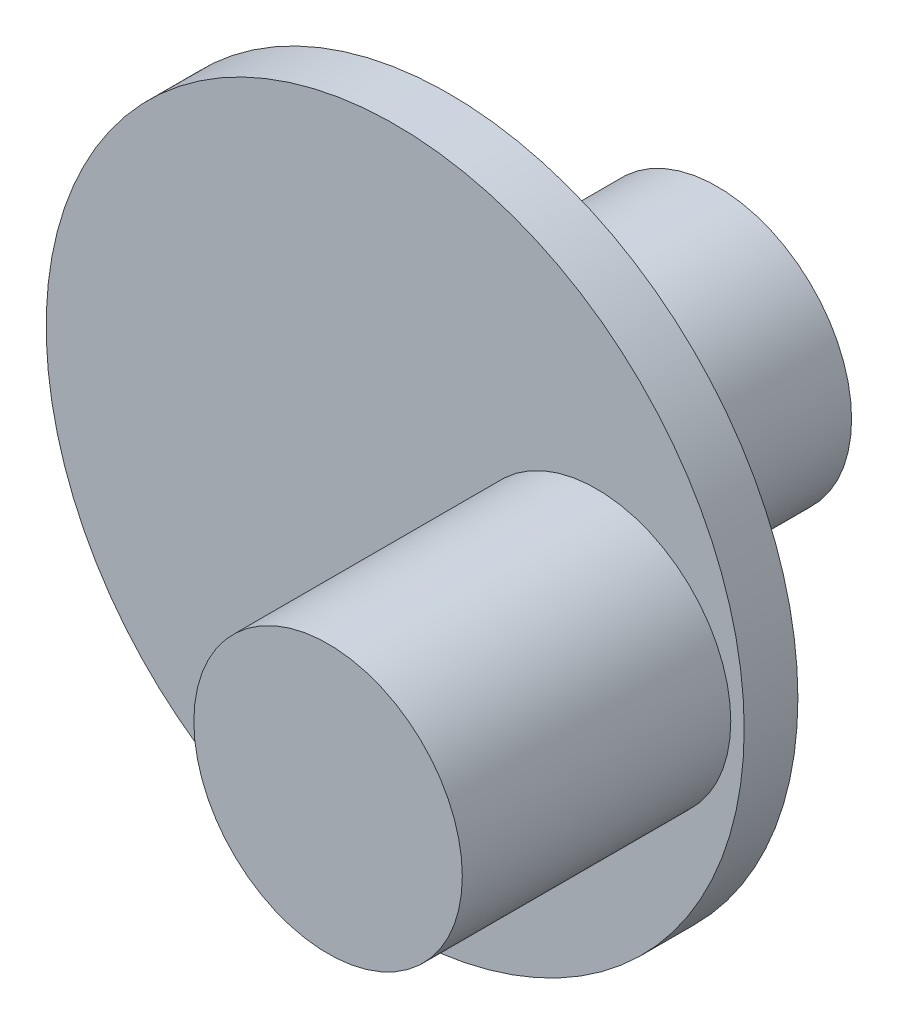
ISO-10303-21;
HEADER;
FILE_DESCRIPTION(('STEP AP214'),'2;1');
FILE_NAME('part.step','',(''),(''),'','','');
FILE_SCHEMA(('AUTOMOTIVE_DESIGN { 1 0 10303 214 1 1 1 1 }'));
ENDSEC;
DATA;
#1=APPLICATION_CONTEXT('core data for automotive mechanical design processes');
#2=APPLICATION_PROTOCOL_DEFINITION('international standard','automotive_design',2000,#1);
#3=PRODUCT_CONTEXT('',#1,'mechanical');
#4=PRODUCT('Part','Part','',(#3));
#5=PRODUCT_RELATED_PRODUCT_CATEGORY('part','',(#4));
#6=PRODUCT_DEFINITION_FORMATION('','',#4);
#7=PRODUCT_DEFINITION_CONTEXT('part definition',#1,'design');
#8=PRODUCT_DEFINITION('design','',#6,#7);
#9=PRODUCT_DEFINITION_SHAPE('','',#8);
#10=(LENGTH_UNIT() NAMED_UNIT(*) SI_UNIT(.MILLI.,.METRE.));
#11=(NAMED_UNIT(*) PLANE_ANGLE_UNIT() SI_UNIT($,.RADIAN.));
#12=(NAMED_UNIT(*) SI_UNIT($,.STERADIAN.) SOLID_ANGLE_UNIT());
#13=UNCERTAINTY_MEASURE_WITH_UNIT(LENGTH_MEASURE(1.E-05),#10,'distance_accuracy_value','');
#14=(GEOMETRIC_REPRESENTATION_CONTEXT(3) GLOBAL_UNCERTAINTY_ASSIGNED_CONTEXT((#13)) GLOBAL_UNIT_ASSIGNED_CONTEXT((#10,
#11,#12)) REPRESENTATION_CONTEXT('',''));
#15=CARTESIAN_POINT('',(0.,0.,0.));
#16=DIRECTION('',(0.,0.,1.));
#17=DIRECTION('',(1.,0.,0.));
#18=AXIS2_PLACEMENT_3D('',#15,#16,#17);
#19=CARTESIAN_POINT('',(0.,0.,12.));
#20=DIRECTION('',(0.,0.,1.));
#21=DIRECTION('',(1.,0.,0.));
#22=AXIS2_PLACEMENT_3D('',#19,#20,#21);
#23=PLANE('',#22);
#24=CARTESIAN_POINT('',(0.,0.,12.));
#25=DIRECTION('',(0.,0.,1.));
#26=DIRECTION('',(1.,0.,0.));
#27=AXIS2_PLACEMENT_3D('',#24,#25,#26);
#28=CIRCLE('',#27,13.);
#29=CARTESIAN_POINT('',(13.,0.,12.));
#30=VERTEX_POINT('',#29);
#31=EDGE_CURVE('E42',#30,#30,#28,.T.);
#32=ORIENTED_EDGE('',*,*,#31,.T.);
#33=EDGE_LOOP('',(#32));
#34=FACE_BOUND('',#33,.T.);
#35=CARTESIAN_POINT('',(7.5,0.,12.));
#36=DIRECTION('',(0.,0.,1.));
#37=DIRECTION('',(1.,0.,0.));
#38=AXIS2_PLACEMENT_3D('',#35,#36,#37);
#39=CIRCLE('',#38,5.);
#40=CARTESIAN_POINT('',(12.5,0.,12.));
#41=VERTEX_POINT('',#40);
#42=EDGE_CURVE('E50',#41,#41,#39,.T.);
#43=ORIENTED_EDGE('',*,*,#42,.F.);
#44=EDGE_LOOP('',(#43));
#45=FACE_BOUND('',#44,.T.);
#46=ADVANCED_FACE('F31',(#34,#45),#23,.T.);
#47=CARTESIAN_POINT('',(0.,0.,10.));
#48=DIRECTION('',(0.,0.,-1.));
#49=DIRECTION('',(-1.,0.,0.));
#50=AXIS2_PLACEMENT_3D('',#47,#48,#49);
#51=CYLINDRICAL_SURFACE('',#50,5.);
#52=CARTESIAN_POINT('',(0.,0.,10.));
#53=DIRECTION('',(0.,0.,1.));
#54=DIRECTION('',(1.,0.,0.));
#55=AXIS2_PLACEMENT_3D('',#52,#53,#54);
#56=CIRCLE('',#55,5.);
#57=CARTESIAN_POINT('',(5.,0.,10.));
#58=VERTEX_POINT('',#57);
#59=EDGE_CURVE('E10',#58,#58,#56,.T.);
#60=ORIENTED_EDGE('',*,*,#59,.F.);
#61=EDGE_LOOP('',(#60));
#62=FACE_BOUND('',#61,.T.);
#63=CARTESIAN_POINT('',(0.,0.,0.));
#64=DIRECTION('',(0.,0.,1.));
#65=DIRECTION('',(1.,0.,0.));
#66=AXIS2_PLACEMENT_3D('',#63,#64,#65);
#67=CIRCLE('',#66,5.);
#68=CARTESIAN_POINT('',(5.,0.,0.));
#69=VERTEX_POINT('',#68);
#70=EDGE_CURVE('E35',#69,#69,#67,.T.);
#71=ORIENTED_EDGE('',*,*,#70,.T.);
#72=EDGE_LOOP('',(#71));
#73=FACE_BOUND('',#72,.T.);
#74=ADVANCED_FACE('F33',(#62,#73),#51,.T.);
#75=CARTESIAN_POINT('',(0.,0.,0.));
#76=DIRECTION('',(0.,0.,1.));
#77=DIRECTION('',(1.,0.,0.));
#78=AXIS2_PLACEMENT_3D('',#75,#76,#77);
#79=PLANE('',#78);
#80=ORIENTED_EDGE('',*,*,#70,.F.);
#81=EDGE_LOOP('',(#80));
#82=FACE_BOUND('',#81,.T.);
#83=ADVANCED_FACE('F71',(#82),#79,.F.);
#84=CARTESIAN_POINT('',(0.,0.,10.));
#85=DIRECTION('',(0.,0.,1.));
#86=DIRECTION('',(1.,0.,0.));
#87=AXIS2_PLACEMENT_3D('',#84,#85,#86);
#88=PLANE('',#87);
#89=CARTESIAN_POINT('',(0.,0.,10.));
#90=DIRECTION('',(0.,0.,1.));
#91=DIRECTION('',(1.,0.,0.));
#92=AXIS2_PLACEMENT_3D('',#89,#90,#91);
#93=CIRCLE('',#92,13.);
#94=CARTESIAN_POINT('',(13.,0.,10.));
#95=VERTEX_POINT('',#94);
#96=EDGE_CURVE('E44',#95,#95,#93,.T.);
#97=ORIENTED_EDGE('',*,*,#96,.F.);
#98=EDGE_LOOP('',(#97));
#99=FACE_BOUND('',#98,.T.);
#100=ORIENTED_EDGE('',*,*,#59,.T.);
#101=EDGE_LOOP('',(#100));
#102=FACE_BOUND('',#101,.T.);
#103=ADVANCED_FACE('F75',(#99,#102),#88,.F.);
#104=CARTESIAN_POINT('',(0.,0.,12.));
#105=DIRECTION('',(0.,0.,-1.));
#106=DIRECTION('',(-1.,0.,0.));
#107=AXIS2_PLACEMENT_3D('',#104,#105,#106);
#108=CYLINDRICAL_SURFACE('',#107,13.);
#109=ORIENTED_EDGE('',*,*,#31,.F.);
#110=EDGE_LOOP('',(#109));
#111=FACE_BOUND('',#110,.T.);
#112=ORIENTED_EDGE('',*,*,#96,.T.);
#113=EDGE_LOOP('',(#112));
#114=FACE_BOUND('',#113,.T.);
#115=ADVANCED_FACE('F61',(#111,#114),#108,.T.);
#116=CARTESIAN_POINT('',(7.5,0.,22.));
#117=DIRECTION('',(0.,0.,-1.));
#118=DIRECTION('',(-1.,0.,0.));
#119=AXIS2_PLACEMENT_3D('',#116,#117,#118);
#120=CYLINDRICAL_SURFACE('',#119,5.);
#121=CARTESIAN_POINT('',(7.5,0.,22.));
#122=DIRECTION('',(0.,0.,1.));
#123=DIRECTION('',(1.,0.,0.));
#124=AXIS2_PLACEMENT_3D('',#121,#122,#123);
#125=CIRCLE('',#124,5.);
#126=CARTESIAN_POINT('',(12.5,0.,22.));
#127=VERTEX_POINT('',#126);
#128=EDGE_CURVE('E47',#127,#127,#125,.T.);
#129=ORIENTED_EDGE('',*,*,#128,.F.);
#130=EDGE_LOOP('',(#129));
#131=FACE_BOUND('',#130,.T.);
#132=ORIENTED_EDGE('',*,*,#42,.T.);
#133=EDGE_LOOP('',(#132));
#134=FACE_BOUND('',#133,.T.);
#135=ADVANCED_FACE('F58',(#131,#134),#120,.T.);
#136=CARTESIAN_POINT('',(7.5,0.,22.));
#137=DIRECTION('',(0.,0.,1.));
#138=DIRECTION('',(1.,0.,0.));
#139=AXIS2_PLACEMENT_3D('',#136,#137,#138);
#140=PLANE('',#139);
#141=ORIENTED_EDGE('',*,*,#128,.T.);
#142=EDGE_LOOP('',(#141));
#143=FACE_BOUND('',#142,.T.);
#144=ADVANCED_FACE('F56',(#143),#140,.T.);
#145=CLOSED_SHELL('',(#46,#74,#83,#103,#115,#135,#144));
#146=MANIFOLD_SOLID_BREP('B2',#145);
#147=ADVANCED_BREP_SHAPE_REPRESENTATION('',(#18,#146),#14);
#148=SHAPE_DEFINITION_REPRESENTATION(#9,#147);
ENDSEC;
END-ISO-10303-21;
